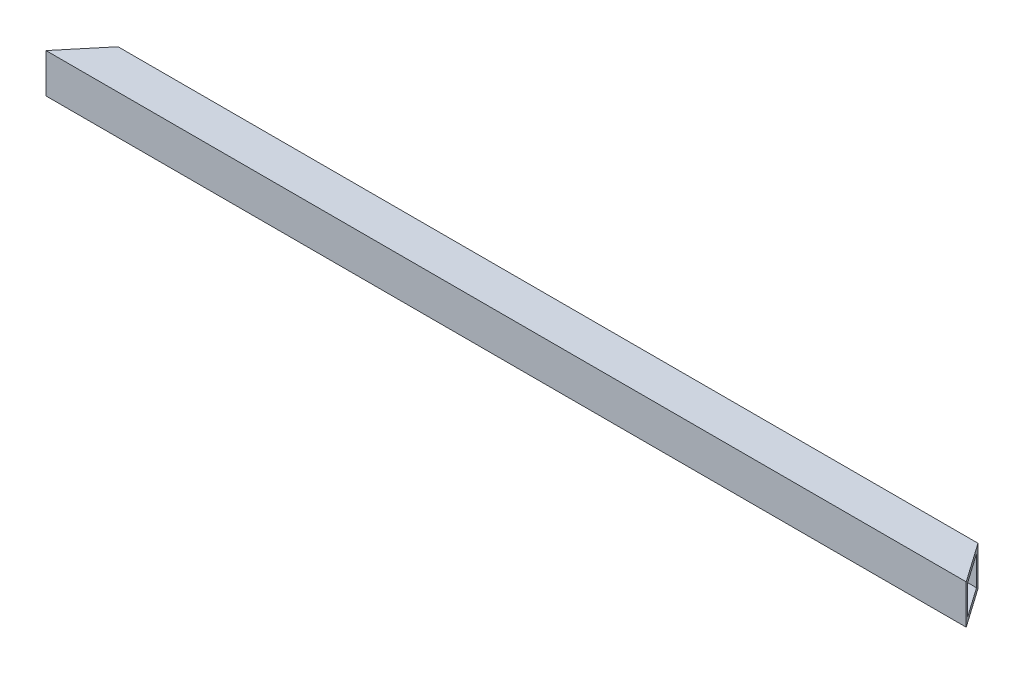
ISO-10303-21;
HEADER;
FILE_DESCRIPTION(('STEP AP214'),'2;1');
FILE_NAME('part.step','',(''),(''),'','','');
FILE_SCHEMA(('AUTOMOTIVE_DESIGN { 1 0 10303 214 1 1 1 1 }'));
ENDSEC;
DATA;
#1=APPLICATION_CONTEXT('core data for automotive mechanical design processes');
#2=APPLICATION_PROTOCOL_DEFINITION('international standard','automotive_design',2000,#1);
#3=PRODUCT_CONTEXT('',#1,'mechanical');
#4=PRODUCT('Part','Part','',(#3));
#5=PRODUCT_RELATED_PRODUCT_CATEGORY('part','',(#4));
#6=PRODUCT_DEFINITION_FORMATION('','',#4);
#7=PRODUCT_DEFINITION_CONTEXT('part definition',#1,'design');
#8=PRODUCT_DEFINITION('design','',#6,#7);
#9=PRODUCT_DEFINITION_SHAPE('','',#8);
#10=(LENGTH_UNIT() NAMED_UNIT(*) SI_UNIT(.MILLI.,.METRE.));
#11=(NAMED_UNIT(*) PLANE_ANGLE_UNIT() SI_UNIT($,.RADIAN.));
#12=(NAMED_UNIT(*) SI_UNIT($,.STERADIAN.) SOLID_ANGLE_UNIT());
#13=UNCERTAINTY_MEASURE_WITH_UNIT(LENGTH_MEASURE(1.E-05),#10,'distance_accuracy_value','');
#14=(GEOMETRIC_REPRESENTATION_CONTEXT(3) GLOBAL_UNCERTAINTY_ASSIGNED_CONTEXT((#13)) GLOBAL_UNIT_ASSIGNED_CONTEXT((#10,
#11,#12)) REPRESENTATION_CONTEXT('',''));
#15=CARTESIAN_POINT('',(0.,0.,0.));
#16=DIRECTION('',(0.,0.,1.));
#17=DIRECTION('',(1.,0.,0.));
#18=AXIS2_PLACEMENT_3D('',#15,#16,#17);
#19=CARTESIAN_POINT('',(148.59,-6.35,-6.35));
#20=DIRECTION('',(0.,0.,1.));
#21=DIRECTION('',(1.,0.,0.));
#22=AXIS2_PLACEMENT_3D('',#19,#20,#21);
#23=PLANE('',#22);
#24=DIRECTION('',(-1.,0.,0.));
#25=VECTOR('',#24,1.);
#26=CARTESIAN_POINT('',(148.59,-6.35,-6.35));
#27=LINE('',#26,#25);
#28=CARTESIAN_POINT('',(139.697364264737,-6.35,-6.35));
#29=VERTEX_POINT('',#28);
#30=CARTESIAN_POINT('',(-138.01673485871,-6.35,-6.35));
#31=VERTEX_POINT('',#30);
#32=EDGE_CURVE('E119',#29,#31,#27,.T.);
#33=ORIENTED_EDGE('',*,*,#32,.T.);
#34=DIRECTION('',(0.,1.,0.));
#35=VECTOR('',#34,1.);
#36=CARTESIAN_POINT('',(-138.01673485871,-6.35,-6.35));
#37=LINE('',#36,#35);
#38=CARTESIAN_POINT('',(-138.01673485871,6.35,-6.35));
#39=VERTEX_POINT('',#38);
#40=EDGE_CURVE('E46',#31,#39,#37,.T.);
#41=ORIENTED_EDGE('',*,*,#40,.T.);
#42=DIRECTION('',(-1.,0.,0.));
#43=VECTOR('',#42,1.);
#44=CARTESIAN_POINT('',(148.59,6.35,-6.35));
#45=LINE('',#44,#43);
#46=CARTESIAN_POINT('',(139.697364264737,6.35,-6.35));
#47=VERTEX_POINT('',#46);
#48=EDGE_CURVE('E113',#47,#39,#45,.T.);
#49=ORIENTED_EDGE('',*,*,#48,.F.);
#50=DIRECTION('',(0.,-1.,0.));
#51=VECTOR('',#50,1.);
#52=CARTESIAN_POINT('',(139.697364264737,-6.35,-6.35));
#53=LINE('',#52,#51);
#54=EDGE_CURVE('E149',#47,#29,#53,.T.);
#55=ORIENTED_EDGE('',*,*,#54,.T.);
#56=EDGE_LOOP('',(#33,#41,#49,#55));
#57=FACE_BOUND('',#56,.T.);
#58=ADVANCED_FACE('F32',(#57),#23,.F.);
#59=CARTESIAN_POINT('',(148.59,6.35,6.35));
#60=DIRECTION('',(0.,-1.,0.));
#61=DIRECTION('',(0.,0.,-1.));
#62=AXIS2_PLACEMENT_3D('',#59,#60,#61);
#63=PLANE('',#62);
#64=ORIENTED_EDGE('',*,*,#48,.T.);
#65=DIRECTION('',(0.639824765644478,0.,-0.768520832032541));
#66=VECTOR('',#65,1.);
#67=CARTESIAN_POINT('',(-138.01673485871,6.35,-6.35));
#68=LINE('',#67,#66);
#69=CARTESIAN_POINT('',(-148.59,6.35,6.35));
#70=VERTEX_POINT('',#69);
#71=EDGE_CURVE('E96',#70,#39,#68,.T.);
#72=ORIENTED_EDGE('',*,*,#71,.F.);
#73=DIRECTION('',(-1.,0.,0.));
#74=VECTOR('',#73,1.);
#75=CARTESIAN_POINT('',(148.59,6.35,6.35));
#76=LINE('',#75,#74);
#77=CARTESIAN_POINT('',(148.59,6.35,6.35));
#78=VERTEX_POINT('',#77);
#79=EDGE_CURVE('E110',#78,#70,#76,.T.);
#80=ORIENTED_EDGE('',*,*,#79,.F.);
#81=DIRECTION('',(0.57357643635105,0.,0.819152044288989));
#82=VECTOR('',#81,1.);
#83=CARTESIAN_POINT('',(148.59,6.35,6.35));
#84=LINE('',#83,#82);
#85=EDGE_CURVE('E170',#47,#78,#84,.T.);
#86=ORIENTED_EDGE('',*,*,#85,.F.);
#87=EDGE_LOOP('',(#64,#72,#80,#86));
#88=FACE_BOUND('',#87,.T.);
#89=ADVANCED_FACE('F108',(#88),#63,.F.);
#90=CARTESIAN_POINT('',(148.59,-6.35,6.35));
#91=DIRECTION('',(0.,0.,-1.));
#92=DIRECTION('',(-1.,0.,0.));
#93=AXIS2_PLACEMENT_3D('',#90,#91,#92);
#94=PLANE('',#93);
#95=DIRECTION('',(0.,-1.,0.));
#96=VECTOR('',#95,1.);
#97=CARTESIAN_POINT('',(-148.59,-6.35,6.35));
#98=LINE('',#97,#96);
#99=CARTESIAN_POINT('',(-148.59,-6.35,6.35));
#100=VERTEX_POINT('',#99);
#101=EDGE_CURVE('E93',#70,#100,#98,.T.);
#102=ORIENTED_EDGE('',*,*,#101,.T.);
#103=DIRECTION('',(-1.,0.,0.));
#104=VECTOR('',#103,1.);
#105=CARTESIAN_POINT('',(148.59,-6.35,6.35));
#106=LINE('',#105,#104);
#107=CARTESIAN_POINT('',(148.59,-6.35,6.35));
#108=VERTEX_POINT('',#107);
#109=EDGE_CURVE('E116',#108,#100,#106,.T.);
#110=ORIENTED_EDGE('',*,*,#109,.F.);
#111=DIRECTION('',(0.,-1.,0.));
#112=VECTOR('',#111,1.);
#113=CARTESIAN_POINT('',(148.59,-6.35,6.35));
#114=LINE('',#113,#112);
#115=EDGE_CURVE('E102',#78,#108,#114,.T.);
#116=ORIENTED_EDGE('',*,*,#115,.F.);
#117=ORIENTED_EDGE('',*,*,#79,.T.);
#118=EDGE_LOOP('',(#102,#110,#116,#117));
#119=FACE_BOUND('',#118,.T.);
#120=ADVANCED_FACE('F115',(#119),#94,.F.);
#121=CARTESIAN_POINT('',(148.59,-6.35,6.35));
#122=DIRECTION('',(0.,1.,0.));
#123=DIRECTION('',(0.,0.,1.));
#124=AXIS2_PLACEMENT_3D('',#121,#122,#123);
#125=PLANE('',#124);
#126=ORIENTED_EDGE('',*,*,#109,.T.);
#127=DIRECTION('',(0.639824765644478,0.,-0.768520832032541));
#128=VECTOR('',#127,1.);
#129=CARTESIAN_POINT('',(-138.01673485871,-6.35,-6.35));
#130=LINE('',#129,#128);
#131=EDGE_CURVE('E97',#100,#31,#130,.T.);
#132=ORIENTED_EDGE('',*,*,#131,.T.);
#133=ORIENTED_EDGE('',*,*,#32,.F.);
#134=DIRECTION('',(0.57357643635105,0.,0.819152044288989));
#135=VECTOR('',#134,1.);
#136=CARTESIAN_POINT('',(148.59,-6.35,6.35));
#137=LINE('',#136,#135);
#138=EDGE_CURVE('E143',#29,#108,#137,.T.);
#139=ORIENTED_EDGE('',*,*,#138,.T.);
#140=EDGE_LOOP('',(#126,#132,#133,#139));
#141=FACE_BOUND('',#140,.T.);
#142=ADVANCED_FACE('F161',(#141),#125,.F.);
#143=CARTESIAN_POINT('',(148.59,-4.7625,4.7625));
#144=DIRECTION('',(0.,0.,-1.));
#145=DIRECTION('',(-1.,0.,0.));
#146=AXIS2_PLACEMENT_3D('',#143,#144,#145);
#147=PLANE('',#146);
#148=DIRECTION('',(0.,-1.,0.));
#149=VECTOR('',#148,1.);
#150=CARTESIAN_POINT('',(-147.268341857339,-4.7625,4.7625));
#151=LINE('',#150,#149);
#152=CARTESIAN_POINT('',(-147.268341857339,4.7625,4.7625));
#153=VERTEX_POINT('',#152);
#154=CARTESIAN_POINT('',(-147.268341857339,-4.7625,4.7625));
#155=VERTEX_POINT('',#154);
#156=EDGE_CURVE('E168',#153,#155,#151,.T.);
#157=ORIENTED_EDGE('',*,*,#156,.F.);
#158=DIRECTION('',(-1.,0.,0.));
#159=VECTOR('',#158,1.);
#160=CARTESIAN_POINT('',(148.59,4.7625,4.7625));
#161=LINE('',#160,#159);
#162=CARTESIAN_POINT('',(147.478420533092,4.7625,4.7625));
#163=VERTEX_POINT('',#162);
#164=EDGE_CURVE('E146',#163,#153,#161,.T.);
#165=ORIENTED_EDGE('',*,*,#164,.F.);
#166=DIRECTION('',(0.,1.,0.));
#167=VECTOR('',#166,1.);
#168=CARTESIAN_POINT('',(147.478420533092,-4.7625,4.7625));
#169=LINE('',#168,#167);
#170=CARTESIAN_POINT('',(147.478420533092,-4.7625,4.7625));
#171=VERTEX_POINT('',#170);
#172=EDGE_CURVE('E130',#171,#163,#169,.T.);
#173=ORIENTED_EDGE('',*,*,#172,.F.);
#174=DIRECTION('',(-1.,0.,0.));
#175=VECTOR('',#174,1.);
#176=CARTESIAN_POINT('',(148.59,-4.7625,4.7625));
#177=LINE('',#176,#175);
#178=EDGE_CURVE('E103',#171,#155,#177,.T.);
#179=ORIENTED_EDGE('',*,*,#178,.T.);
#180=EDGE_LOOP('',(#157,#165,#173,#179));
#181=FACE_BOUND('',#180,.T.);
#182=ADVANCED_FACE('F178',(#181),#147,.T.);
#183=CARTESIAN_POINT('',(148.59,-4.7625,4.7625));
#184=DIRECTION('',(0.,1.,0.));
#185=DIRECTION('',(0.,0.,1.));
#186=AXIS2_PLACEMENT_3D('',#183,#184,#185);
#187=PLANE('',#186);
#188=DIRECTION('',(0.639824765644478,0.,-0.768520832032541));
#189=VECTOR('',#188,1.);
#190=CARTESIAN_POINT('',(-26.1511169663294,-4.7625,-140.716567777179));
#191=LINE('',#190,#189);
#192=CARTESIAN_POINT('',(-139.338393001371,-4.7625,-4.7625));
#193=VERTEX_POINT('',#192);
#194=EDGE_CURVE('E166',#155,#193,#191,.T.);
#195=ORIENTED_EDGE('',*,*,#194,.F.);
#196=ORIENTED_EDGE('',*,*,#178,.F.);
#197=DIRECTION('',(0.57357643635105,0.,0.819152044288989));
#198=VECTOR('',#197,1.);
#199=CARTESIAN_POINT('',(147.844118982251,-4.7625,5.28477151123526));
#200=LINE('',#199,#198);
#201=CARTESIAN_POINT('',(140.808943731645,-4.7625,-4.7625));
#202=VERTEX_POINT('',#201);
#203=EDGE_CURVE('E142',#202,#171,#200,.T.);
#204=ORIENTED_EDGE('',*,*,#203,.F.);
#205=DIRECTION('',(-1.,0.,0.));
#206=VECTOR('',#205,1.);
#207=CARTESIAN_POINT('',(148.59,-4.7625,-4.7625));
#208=LINE('',#207,#206);
#209=EDGE_CURVE('E141',#202,#193,#208,.T.);
#210=ORIENTED_EDGE('',*,*,#209,.T.);
#211=EDGE_LOOP('',(#195,#196,#204,#210));
#212=FACE_BOUND('',#211,.T.);
#213=ADVANCED_FACE('F180',(#212),#187,.T.);
#214=CARTESIAN_POINT('',(148.59,-4.7625,-4.7625));
#215=DIRECTION('',(0.,0.,1.));
#216=DIRECTION('',(1.,0.,0.));
#217=AXIS2_PLACEMENT_3D('',#214,#215,#216);
#218=PLANE('',#217);
#219=DIRECTION('',(0.,1.,0.));
#220=VECTOR('',#219,1.);
#221=CARTESIAN_POINT('',(-139.338393001371,-4.7625,-4.7625));
#222=LINE('',#221,#220);
#223=CARTESIAN_POINT('',(-139.338393001371,4.7625,-4.7625));
#224=VERTEX_POINT('',#223);
#225=EDGE_CURVE('E53',#193,#224,#222,.T.);
#226=ORIENTED_EDGE('',*,*,#225,.F.);
#227=ORIENTED_EDGE('',*,*,#209,.F.);
#228=DIRECTION('',(0.,-1.,0.));
#229=VECTOR('',#228,1.);
#230=CARTESIAN_POINT('',(140.808943731645,-4.7625,-4.7625));
#231=LINE('',#230,#229);
#232=CARTESIAN_POINT('',(140.808943731645,4.7625,-4.7625));
#233=VERTEX_POINT('',#232);
#234=EDGE_CURVE('E127',#233,#202,#231,.T.);
#235=ORIENTED_EDGE('',*,*,#234,.F.);
#236=DIRECTION('',(-1.,0.,0.));
#237=VECTOR('',#236,1.);
#238=CARTESIAN_POINT('',(148.59,4.7625,-4.7625));
#239=LINE('',#238,#237);
#240=EDGE_CURVE('E139',#233,#224,#239,.T.);
#241=ORIENTED_EDGE('',*,*,#240,.T.);
#242=EDGE_LOOP('',(#226,#227,#235,#241));
#243=FACE_BOUND('',#242,.T.);
#244=ADVANCED_FACE('F138',(#243),#218,.T.);
#245=CARTESIAN_POINT('',(148.59,4.7625,4.7625));
#246=DIRECTION('',(0.,-1.,0.));
#247=DIRECTION('',(0.,0.,-1.));
#248=AXIS2_PLACEMENT_3D('',#245,#246,#247);
#249=PLANE('',#248);
#250=DIRECTION('',(-0.639824765644478,0.,0.768520832032541));
#251=VECTOR('',#250,1.);
#252=CARTESIAN_POINT('',(-26.1511169663294,4.7625,-140.716567777179));
#253=LINE('',#252,#251);
#254=EDGE_CURVE('E11',#224,#153,#253,.T.);
#255=ORIENTED_EDGE('',*,*,#254,.F.);
#256=ORIENTED_EDGE('',*,*,#240,.F.);
#257=DIRECTION('',(-0.57357643635105,0.,-0.819152044288989));
#258=VECTOR('',#257,1.);
#259=CARTESIAN_POINT('',(147.844118982251,4.7625,5.28477151123526));
#260=LINE('',#259,#258);
#261=EDGE_CURVE('E39',#163,#233,#260,.T.);
#262=ORIENTED_EDGE('',*,*,#261,.F.);
#263=ORIENTED_EDGE('',*,*,#164,.T.);
#264=EDGE_LOOP('',(#255,#256,#262,#263));
#265=FACE_BOUND('',#264,.T.);
#266=ADVANCED_FACE('F145',(#265),#249,.T.);
#267=CARTESIAN_POINT('',(148.59,-6.35,6.35));
#268=DIRECTION('',(-0.819152044288989,0.,0.57357643635105));
#269=DIRECTION('',(0.57357643635105,0.,0.819152044288989));
#270=AXIS2_PLACEMENT_3D('',#267,#268,#269);
#271=PLANE('',#270);
#272=ORIENTED_EDGE('',*,*,#172,.T.);
#273=ORIENTED_EDGE('',*,*,#261,.T.);
#274=ORIENTED_EDGE('',*,*,#234,.T.);
#275=ORIENTED_EDGE('',*,*,#203,.T.);
#276=EDGE_LOOP('',(#272,#273,#274,#275));
#277=FACE_BOUND('',#276,.T.);
#278=ORIENTED_EDGE('',*,*,#85,.T.);
#279=ORIENTED_EDGE('',*,*,#115,.T.);
#280=ORIENTED_EDGE('',*,*,#138,.F.);
#281=ORIENTED_EDGE('',*,*,#54,.F.);
#282=EDGE_LOOP('',(#278,#279,#280,#281));
#283=FACE_BOUND('',#282,.T.);
#284=ADVANCED_FACE('F125',(#277,#283),#271,.F.);
#285=CARTESIAN_POINT('',(-138.01673485871,-6.35,-6.35));
#286=DIRECTION('',(0.768520832032541,0.,0.639824765644478));
#287=DIRECTION('',(0.639824765644478,0.,-0.768520832032541));
#288=AXIS2_PLACEMENT_3D('',#285,#286,#287);
#289=PLANE('',#288);
#290=ORIENTED_EDGE('',*,*,#156,.T.);
#291=ORIENTED_EDGE('',*,*,#194,.T.);
#292=ORIENTED_EDGE('',*,*,#225,.T.);
#293=ORIENTED_EDGE('',*,*,#254,.T.);
#294=EDGE_LOOP('',(#290,#291,#292,#293));
#295=FACE_BOUND('',#294,.T.);
#296=ORIENTED_EDGE('',*,*,#40,.F.);
#297=ORIENTED_EDGE('',*,*,#131,.F.);
#298=ORIENTED_EDGE('',*,*,#101,.F.);
#299=ORIENTED_EDGE('',*,*,#71,.T.);
#300=EDGE_LOOP('',(#296,#297,#298,#299));
#301=FACE_BOUND('',#300,.T.);
#302=ADVANCED_FACE('F95',(#295,#301),#289,.F.);
#303=CLOSED_SHELL('',(#58,#89,#120,#142,#182,#213,#244,#266,#284,#302));
#304=MANIFOLD_SOLID_BREP('B2',#303);
#305=ADVANCED_BREP_SHAPE_REPRESENTATION('',(#18,#304),#14);
#306=SHAPE_DEFINITION_REPRESENTATION(#9,#305);
ENDSEC;
END-ISO-10303-21;
